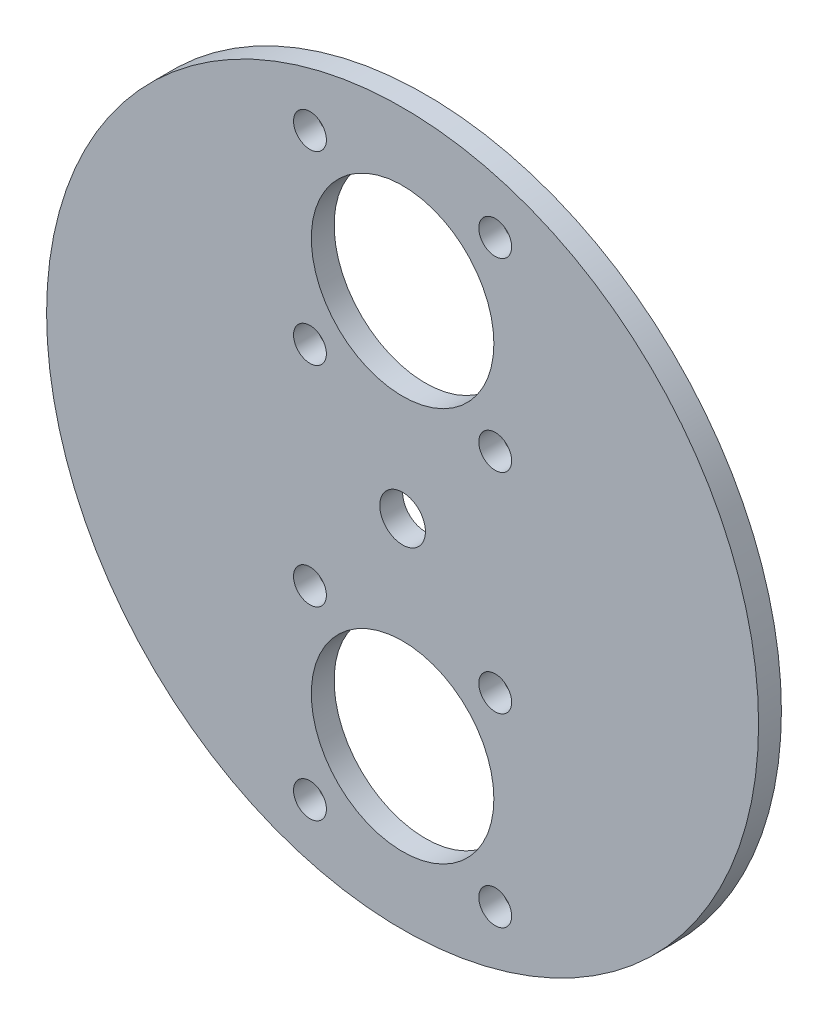
ISO-10303-21;
HEADER;
FILE_DESCRIPTION(('STEP AP214'),'2;1');
FILE_NAME('part.step','',(''),(''),'','','');
FILE_SCHEMA(('AUTOMOTIVE_DESIGN { 1 0 10303 214 1 1 1 1 }'));
ENDSEC;
DATA;
#1=APPLICATION_CONTEXT('core data for automotive mechanical design processes');
#2=APPLICATION_PROTOCOL_DEFINITION('international standard','automotive_design',2000,#1);
#3=PRODUCT_CONTEXT('',#1,'mechanical');
#4=PRODUCT('Part','Part','',(#3));
#5=PRODUCT_RELATED_PRODUCT_CATEGORY('part','',(#4));
#6=PRODUCT_DEFINITION_FORMATION('','',#4);
#7=PRODUCT_DEFINITION_CONTEXT('part definition',#1,'design');
#8=PRODUCT_DEFINITION('design','',#6,#7);
#9=PRODUCT_DEFINITION_SHAPE('','',#8);
#10=(LENGTH_UNIT() NAMED_UNIT(*) SI_UNIT(.MILLI.,.METRE.));
#11=(NAMED_UNIT(*) PLANE_ANGLE_UNIT() SI_UNIT($,.RADIAN.));
#12=(NAMED_UNIT(*) SI_UNIT($,.STERADIAN.) SOLID_ANGLE_UNIT());
#13=UNCERTAINTY_MEASURE_WITH_UNIT(LENGTH_MEASURE(1.E-05),#10,'distance_accuracy_value','');
#14=(GEOMETRIC_REPRESENTATION_CONTEXT(3) GLOBAL_UNCERTAINTY_ASSIGNED_CONTEXT((#13)) GLOBAL_UNIT_ASSIGNED_CONTEXT((#10,
#11,#12)) REPRESENTATION_CONTEXT('',''));
#15=CARTESIAN_POINT('',(0.,0.,0.));
#16=DIRECTION('',(0.,0.,1.));
#17=DIRECTION('',(1.,0.,0.));
#18=AXIS2_PLACEMENT_3D('',#15,#16,#17);
#19=CARTESIAN_POINT('',(0.,0.,3.175));
#20=DIRECTION('',(0.,0.,-1.));
#21=DIRECTION('',(-1.,0.,0.));
#22=AXIS2_PLACEMENT_3D('',#19,#20,#21);
#23=CYLINDRICAL_SURFACE('',#22,49.53);
#24=CARTESIAN_POINT('',(0.,0.,3.175));
#25=DIRECTION('',(0.,0.,1.));
#26=DIRECTION('',(1.,0.,0.));
#27=AXIS2_PLACEMENT_3D('',#24,#25,#26);
#28=CIRCLE('',#27,49.53);
#29=CARTESIAN_POINT('',(49.53,0.,3.175));
#30=VERTEX_POINT('',#29);
#31=EDGE_CURVE('E10',#30,#30,#28,.T.);
#32=ORIENTED_EDGE('',*,*,#31,.F.);
#33=EDGE_LOOP('',(#32));
#34=FACE_BOUND('',#33,.T.);
#35=CARTESIAN_POINT('',(0.,0.,0.));
#36=DIRECTION('',(0.,0.,1.));
#37=DIRECTION('',(1.,0.,0.));
#38=AXIS2_PLACEMENT_3D('',#35,#36,#37);
#39=CIRCLE('',#38,49.53);
#40=CARTESIAN_POINT('',(49.53,0.,0.));
#41=VERTEX_POINT('',#40);
#42=EDGE_CURVE('E46',#41,#41,#39,.T.);
#43=ORIENTED_EDGE('',*,*,#42,.T.);
#44=EDGE_LOOP('',(#43));
#45=FACE_BOUND('',#44,.T.);
#46=ADVANCED_FACE('F43',(#34,#45),#23,.T.);
#47=CARTESIAN_POINT('',(0.,0.,3.175));
#48=DIRECTION('',(0.,0.,1.));
#49=DIRECTION('',(1.,0.,0.));
#50=AXIS2_PLACEMENT_3D('',#47,#48,#49);
#51=PLANE('',#50);
#52=CARTESIAN_POINT('',(-12.8866675337342,40.3186675337343,3.175));
#53=DIRECTION('',(0.,0.,1.));
#54=DIRECTION('',(1.,0.,0.));
#55=AXIS2_PLACEMENT_3D('',#52,#53,#54);
#56=CIRCLE('',#55,2.286);
#57=CARTESIAN_POINT('',(-10.6006675337342,40.3186675337343,3.175));
#58=VERTEX_POINT('',#57);
#59=EDGE_CURVE('E120',#58,#58,#56,.F.);
#60=ORIENTED_EDGE('',*,*,#59,.T.);
#61=EDGE_LOOP('',(#60));
#62=FACE_BOUND('',#61,.T.);
#63=CARTESIAN_POINT('',(12.8866675337343,40.3186675337342,3.175));
#64=DIRECTION('',(0.,0.,1.));
#65=DIRECTION('',(1.,0.,0.));
#66=AXIS2_PLACEMENT_3D('',#63,#64,#65);
#67=CIRCLE('',#66,2.286);
#68=CARTESIAN_POINT('',(15.1726675337343,40.3186675337342,3.175));
#69=VERTEX_POINT('',#68);
#70=EDGE_CURVE('E130',#69,#69,#67,.F.);
#71=ORIENTED_EDGE('',*,*,#70,.T.);
#72=EDGE_LOOP('',(#71));
#73=FACE_BOUND('',#72,.T.);
#74=CARTESIAN_POINT('',(12.8866675337341,14.5453324662656,3.175));
#75=DIRECTION('',(0.,0.,1.));
#76=DIRECTION('',(1.,0.,0.));
#77=AXIS2_PLACEMENT_3D('',#74,#75,#76);
#78=CIRCLE('',#77,2.286);
#79=CARTESIAN_POINT('',(15.1726675337341,14.5453324662656,3.175));
#80=VERTEX_POINT('',#79);
#81=EDGE_CURVE('E121',#80,#80,#78,.F.);
#82=ORIENTED_EDGE('',*,*,#81,.T.);
#83=EDGE_LOOP('',(#82));
#84=FACE_BOUND('',#83,.T.);
#85=CARTESIAN_POINT('',(-12.8866675337343,14.5453324662658,3.175));
#86=DIRECTION('',(0.,0.,1.));
#87=DIRECTION('',(1.,0.,0.));
#88=AXIS2_PLACEMENT_3D('',#85,#86,#87);
#89=CIRCLE('',#88,2.286);
#90=CARTESIAN_POINT('',(-10.6006675337343,14.5453324662658,3.175));
#91=VERTEX_POINT('',#90);
#92=EDGE_CURVE('E98',#91,#91,#89,.F.);
#93=ORIENTED_EDGE('',*,*,#92,.T.);
#94=EDGE_LOOP('',(#93));
#95=FACE_BOUND('',#94,.T.);
#96=CARTESIAN_POINT('',(12.8866675337342,-40.3186675337343,3.175));
#97=DIRECTION('',(0.,0.,1.));
#98=DIRECTION('',(1.,0.,0.));
#99=AXIS2_PLACEMENT_3D('',#96,#97,#98);
#100=CIRCLE('',#99,2.286);
#101=CARTESIAN_POINT('',(15.1726675337342,-40.3186675337343,3.175));
#102=VERTEX_POINT('',#101);
#103=EDGE_CURVE('E88',#102,#102,#100,.F.);
#104=ORIENTED_EDGE('',*,*,#103,.T.);
#105=EDGE_LOOP('',(#104));
#106=FACE_BOUND('',#105,.T.);
#107=CARTESIAN_POINT('',(-12.8866675337342,-40.3186675337342,3.175));
#108=DIRECTION('',(0.,0.,1.));
#109=DIRECTION('',(1.,0.,0.));
#110=AXIS2_PLACEMENT_3D('',#107,#108,#109);
#111=CIRCLE('',#110,2.286);
#112=CARTESIAN_POINT('',(-10.6006675337342,-40.3186675337342,3.175));
#113=VERTEX_POINT('',#112);
#114=EDGE_CURVE('E99',#113,#113,#111,.F.);
#115=ORIENTED_EDGE('',*,*,#114,.T.);
#116=EDGE_LOOP('',(#115));
#117=FACE_BOUND('',#116,.T.);
#118=CARTESIAN_POINT('',(-12.8866675337341,-14.5453324662656,3.175));
#119=DIRECTION('',(0.,0.,1.));
#120=DIRECTION('',(1.,0.,0.));
#121=AXIS2_PLACEMENT_3D('',#118,#119,#120);
#122=CIRCLE('',#121,2.286);
#123=CARTESIAN_POINT('',(-10.6006675337341,-14.5453324662656,3.175));
#124=VERTEX_POINT('',#123);
#125=EDGE_CURVE('E89',#124,#124,#122,.F.);
#126=ORIENTED_EDGE('',*,*,#125,.T.);
#127=EDGE_LOOP('',(#126));
#128=FACE_BOUND('',#127,.T.);
#129=CARTESIAN_POINT('',(12.8866675337343,-14.5453324662658,3.175));
#130=DIRECTION('',(0.,0.,1.));
#131=DIRECTION('',(1.,0.,0.));
#132=AXIS2_PLACEMENT_3D('',#129,#130,#131);
#133=CIRCLE('',#132,2.286);
#134=CARTESIAN_POINT('',(15.1726675337343,-14.5453324662658,3.175));
#135=VERTEX_POINT('',#134);
#136=EDGE_CURVE('E80',#135,#135,#133,.F.);
#137=ORIENTED_EDGE('',*,*,#136,.T.);
#138=EDGE_LOOP('',(#137));
#139=FACE_BOUND('',#138,.T.);
#140=CARTESIAN_POINT('',(0.,0.,3.175));
#141=DIRECTION('',(0.,0.,1.));
#142=DIRECTION('',(1.,0.,0.));
#143=AXIS2_PLACEMENT_3D('',#140,#141,#142);
#144=CIRCLE('',#143,3.175);
#145=CARTESIAN_POINT('',(3.175,0.,3.175));
#146=VERTEX_POINT('',#145);
#147=EDGE_CURVE('E76',#146,#146,#144,.T.);
#148=ORIENTED_EDGE('',*,*,#147,.F.);
#149=EDGE_LOOP('',(#148));
#150=FACE_BOUND('',#149,.T.);
#151=CARTESIAN_POINT('',(0.,27.432,3.175));
#152=DIRECTION('',(0.,0.,1.));
#153=DIRECTION('',(1.,0.,0.));
#154=AXIS2_PLACEMENT_3D('',#151,#152,#153);
#155=CIRCLE('',#154,12.7);
#156=CARTESIAN_POINT('',(12.7,27.432,3.175));
#157=VERTEX_POINT('',#156);
#158=EDGE_CURVE('E61',#157,#157,#155,.T.);
#159=ORIENTED_EDGE('',*,*,#158,.F.);
#160=EDGE_LOOP('',(#159));
#161=FACE_BOUND('',#160,.T.);
#162=CARTESIAN_POINT('',(0.,-27.432,3.175));
#163=DIRECTION('',(0.,0.,1.));
#164=DIRECTION('',(1.,0.,0.));
#165=AXIS2_PLACEMENT_3D('',#162,#163,#164);
#166=CIRCLE('',#165,12.7);
#167=CARTESIAN_POINT('',(12.7,-27.432,3.175));
#168=VERTEX_POINT('',#167);
#169=EDGE_CURVE('E57',#168,#168,#166,.T.);
#170=ORIENTED_EDGE('',*,*,#169,.F.);
#171=EDGE_LOOP('',(#170));
#172=FACE_BOUND('',#171,.T.);
#173=ORIENTED_EDGE('',*,*,#31,.T.);
#174=EDGE_LOOP('',(#173));
#175=FACE_BOUND('',#174,.T.);
#176=ADVANCED_FACE('F152',(#62,#73,#84,#95,#106,#117,#128,#139,#150,#161,#172,#175),#51,.T.);
#177=CARTESIAN_POINT('',(0.,0.,0.));
#178=DIRECTION('',(0.,0.,1.));
#179=DIRECTION('',(1.,0.,0.));
#180=AXIS2_PLACEMENT_3D('',#177,#178,#179);
#181=PLANE('',#180);
#182=CARTESIAN_POINT('',(-12.8866675337342,40.3186675337343,0.));
#183=DIRECTION('',(0.,0.,-1.));
#184=DIRECTION('',(0.,1.,0.));
#185=AXIS2_PLACEMENT_3D('',#182,#183,#184);
#186=CIRCLE('',#185,2.286);
#187=CARTESIAN_POINT('',(-12.8866675337342,42.6046675337343,0.));
#188=VERTEX_POINT('',#187);
#189=EDGE_CURVE('E134',#188,#188,#186,.T.);
#190=ORIENTED_EDGE('',*,*,#189,.F.);
#191=EDGE_LOOP('',(#190));
#192=FACE_BOUND('',#191,.T.);
#193=CARTESIAN_POINT('',(12.8866675337343,40.3186675337342,0.));
#194=DIRECTION('',(0.,0.,-1.));
#195=DIRECTION('',(1.,0.,0.));
#196=AXIS2_PLACEMENT_3D('',#193,#194,#195);
#197=CIRCLE('',#196,2.286);
#198=CARTESIAN_POINT('',(15.1726675337343,40.3186675337342,0.));
#199=VERTEX_POINT('',#198);
#200=EDGE_CURVE('E125',#199,#199,#197,.T.);
#201=ORIENTED_EDGE('',*,*,#200,.F.);
#202=EDGE_LOOP('',(#201));
#203=FACE_BOUND('',#202,.T.);
#204=CARTESIAN_POINT('',(12.8866675337341,14.5453324662656,0.));
#205=DIRECTION('',(0.,0.,-1.));
#206=DIRECTION('',(0.,-1.,0.));
#207=AXIS2_PLACEMENT_3D('',#204,#205,#206);
#208=CIRCLE('',#207,2.286);
#209=CARTESIAN_POINT('',(12.8866675337341,12.2593324662656,0.));
#210=VERTEX_POINT('',#209);
#211=EDGE_CURVE('E126',#210,#210,#208,.T.);
#212=ORIENTED_EDGE('',*,*,#211,.F.);
#213=EDGE_LOOP('',(#212));
#214=FACE_BOUND('',#213,.T.);
#215=CARTESIAN_POINT('',(-12.8866675337343,14.5453324662658,0.));
#216=DIRECTION('',(0.,0.,-1.));
#217=DIRECTION('',(-1.,0.,0.));
#218=AXIS2_PLACEMENT_3D('',#215,#216,#217);
#219=CIRCLE('',#218,2.286);
#220=CARTESIAN_POINT('',(-15.1726675337343,14.5453324662658,0.));
#221=VERTEX_POINT('',#220);
#222=EDGE_CURVE('E116',#221,#221,#219,.T.);
#223=ORIENTED_EDGE('',*,*,#222,.F.);
#224=EDGE_LOOP('',(#223));
#225=FACE_BOUND('',#224,.T.);
#226=CARTESIAN_POINT('',(12.8866675337342,-40.3186675337343,0.));
#227=DIRECTION('',(0.,0.,-1.));
#228=DIRECTION('',(0.,1.,0.));
#229=AXIS2_PLACEMENT_3D('',#226,#227,#228);
#230=CIRCLE('',#229,2.286);
#231=CARTESIAN_POINT('',(12.8866675337342,-38.0326675337343,0.));
#232=VERTEX_POINT('',#231);
#233=EDGE_CURVE('E103',#232,#232,#230,.T.);
#234=ORIENTED_EDGE('',*,*,#233,.F.);
#235=EDGE_LOOP('',(#234));
#236=FACE_BOUND('',#235,.T.);
#237=CARTESIAN_POINT('',(-12.8866675337342,-40.3186675337342,0.));
#238=DIRECTION('',(0.,0.,-1.));
#239=DIRECTION('',(1.,0.,0.));
#240=AXIS2_PLACEMENT_3D('',#237,#238,#239);
#241=CIRCLE('',#240,2.286);
#242=CARTESIAN_POINT('',(-10.6006675337342,-40.3186675337342,0.));
#243=VERTEX_POINT('',#242);
#244=EDGE_CURVE('E93',#243,#243,#241,.T.);
#245=ORIENTED_EDGE('',*,*,#244,.F.);
#246=EDGE_LOOP('',(#245));
#247=FACE_BOUND('',#246,.T.);
#248=CARTESIAN_POINT('',(-12.8866675337341,-14.5453324662656,0.));
#249=DIRECTION('',(0.,0.,-1.));
#250=DIRECTION('',(0.,-1.,0.));
#251=AXIS2_PLACEMENT_3D('',#248,#249,#250);
#252=CIRCLE('',#251,2.286);
#253=CARTESIAN_POINT('',(-12.8866675337341,-16.8313324662656,0.));
#254=VERTEX_POINT('',#253);
#255=EDGE_CURVE('E94',#254,#254,#252,.T.);
#256=ORIENTED_EDGE('',*,*,#255,.F.);
#257=EDGE_LOOP('',(#256));
#258=FACE_BOUND('',#257,.T.);
#259=CARTESIAN_POINT('',(12.8866675337343,-14.5453324662658,0.));
#260=DIRECTION('',(0.,0.,-1.));
#261=DIRECTION('',(-1.,0.,0.));
#262=AXIS2_PLACEMENT_3D('',#259,#260,#261);
#263=CIRCLE('',#262,2.286);
#264=CARTESIAN_POINT('',(10.6006675337343,-14.5453324662658,0.));
#265=VERTEX_POINT('',#264);
#266=EDGE_CURVE('E84',#265,#265,#263,.T.);
#267=ORIENTED_EDGE('',*,*,#266,.F.);
#268=EDGE_LOOP('',(#267));
#269=FACE_BOUND('',#268,.T.);
#270=CARTESIAN_POINT('',(0.,0.,0.));
#271=DIRECTION('',(0.,0.,1.));
#272=DIRECTION('',(1.,0.,0.));
#273=AXIS2_PLACEMENT_3D('',#270,#271,#272);
#274=CIRCLE('',#273,3.175);
#275=CARTESIAN_POINT('',(3.175,0.,0.));
#276=VERTEX_POINT('',#275);
#277=EDGE_CURVE('E66',#276,#276,#274,.F.);
#278=ORIENTED_EDGE('',*,*,#277,.F.);
#279=EDGE_LOOP('',(#278));
#280=FACE_BOUND('',#279,.T.);
#281=CARTESIAN_POINT('',(0.,27.432,0.));
#282=DIRECTION('',(0.,0.,1.));
#283=DIRECTION('',(1.,0.,0.));
#284=AXIS2_PLACEMENT_3D('',#281,#282,#283);
#285=CIRCLE('',#284,12.7);
#286=CARTESIAN_POINT('',(12.7,27.432,0.));
#287=VERTEX_POINT('',#286);
#288=EDGE_CURVE('E55',#287,#287,#285,.F.);
#289=ORIENTED_EDGE('',*,*,#288,.F.);
#290=EDGE_LOOP('',(#289));
#291=FACE_BOUND('',#290,.T.);
#292=CARTESIAN_POINT('',(0.,-27.432,0.));
#293=DIRECTION('',(0.,0.,1.));
#294=DIRECTION('',(1.,0.,0.));
#295=AXIS2_PLACEMENT_3D('',#292,#293,#294);
#296=CIRCLE('',#295,12.7);
#297=CARTESIAN_POINT('',(12.7,-27.432,0.));
#298=VERTEX_POINT('',#297);
#299=EDGE_CURVE('E62',#298,#298,#296,.F.);
#300=ORIENTED_EDGE('',*,*,#299,.F.);
#301=EDGE_LOOP('',(#300));
#302=FACE_BOUND('',#301,.T.);
#303=ORIENTED_EDGE('',*,*,#42,.F.);
#304=EDGE_LOOP('',(#303));
#305=FACE_BOUND('',#304,.T.);
#306=ADVANCED_FACE('F148',(#192,#203,#214,#225,#236,#247,#258,#269,#280,#291,#302,#305),#181,.F.);
#307=CARTESIAN_POINT('',(0.,-27.432,-35.9210244842766));
#308=DIRECTION('',(0.,0.,1.));
#309=DIRECTION('',(1.,0.,0.));
#310=AXIS2_PLACEMENT_3D('',#307,#308,#309);
#311=CYLINDRICAL_SURFACE('',#310,12.7);
#312=ORIENTED_EDGE('',*,*,#299,.T.);
#313=EDGE_LOOP('',(#312));
#314=FACE_BOUND('',#313,.T.);
#315=ORIENTED_EDGE('',*,*,#169,.T.);
#316=EDGE_LOOP('',(#315));
#317=FACE_BOUND('',#316,.T.);
#318=ADVANCED_FACE('F151',(#314,#317),#311,.F.);
#319=CARTESIAN_POINT('',(0.,27.432,-35.9210244842766));
#320=DIRECTION('',(0.,0.,1.));
#321=DIRECTION('',(1.,0.,0.));
#322=AXIS2_PLACEMENT_3D('',#319,#320,#321);
#323=CYLINDRICAL_SURFACE('',#322,12.7);
#324=ORIENTED_EDGE('',*,*,#288,.T.);
#325=EDGE_LOOP('',(#324));
#326=FACE_BOUND('',#325,.T.);
#327=ORIENTED_EDGE('',*,*,#158,.T.);
#328=EDGE_LOOP('',(#327));
#329=FACE_BOUND('',#328,.T.);
#330=ADVANCED_FACE('F189',(#326,#329),#323,.F.);
#331=CARTESIAN_POINT('',(0.,0.,-8.98025612106915));
#332=DIRECTION('',(0.,0.,1.));
#333=DIRECTION('',(1.,0.,0.));
#334=AXIS2_PLACEMENT_3D('',#331,#332,#333);
#335=CYLINDRICAL_SURFACE('',#334,3.175);
#336=ORIENTED_EDGE('',*,*,#277,.T.);
#337=EDGE_LOOP('',(#336));
#338=FACE_BOUND('',#337,.T.);
#339=ORIENTED_EDGE('',*,*,#147,.T.);
#340=EDGE_LOOP('',(#339));
#341=FACE_BOUND('',#340,.T.);
#342=ADVANCED_FACE('F193',(#338,#341),#335,.F.);
#343=CARTESIAN_POINT('',(12.8866675337343,-14.5453324662658,9.64078440716979));
#344=DIRECTION('',(0.,0.,-1.));
#345=DIRECTION('',(-1.,0.,0.));
#346=AXIS2_PLACEMENT_3D('',#343,#344,#345);
#347=CYLINDRICAL_SURFACE('',#346,2.286);
#348=ORIENTED_EDGE('',*,*,#266,.T.);
#349=EDGE_LOOP('',(#348));
#350=FACE_BOUND('',#349,.T.);
#351=ORIENTED_EDGE('',*,*,#136,.F.);
#352=EDGE_LOOP('',(#351));
#353=FACE_BOUND('',#352,.T.);
#354=ADVANCED_FACE('F197',(#350,#353),#347,.F.);
#355=CARTESIAN_POINT('',(-12.8866675337341,-14.5453324662656,9.64078440716979));
#356=DIRECTION('',(0.,0.,-1.));
#357=DIRECTION('',(-1.,0.,0.));
#358=AXIS2_PLACEMENT_3D('',#355,#356,#357);
#359=CYLINDRICAL_SURFACE('',#358,2.286);
#360=ORIENTED_EDGE('',*,*,#255,.T.);
#361=EDGE_LOOP('',(#360));
#362=FACE_BOUND('',#361,.T.);
#363=ORIENTED_EDGE('',*,*,#125,.F.);
#364=EDGE_LOOP('',(#363));
#365=FACE_BOUND('',#364,.T.);
#366=ADVANCED_FACE('F201',(#362,#365),#359,.F.);
#367=CARTESIAN_POINT('',(-12.8866675337342,-40.3186675337342,9.64078440716979));
#368=DIRECTION('',(0.,0.,-1.));
#369=DIRECTION('',(-1.,0.,0.));
#370=AXIS2_PLACEMENT_3D('',#367,#368,#369);
#371=CYLINDRICAL_SURFACE('',#370,2.286);
#372=ORIENTED_EDGE('',*,*,#244,.T.);
#373=EDGE_LOOP('',(#372));
#374=FACE_BOUND('',#373,.T.);
#375=ORIENTED_EDGE('',*,*,#114,.F.);
#376=EDGE_LOOP('',(#375));
#377=FACE_BOUND('',#376,.T.);
#378=ADVANCED_FACE('F205',(#374,#377),#371,.F.);
#379=CARTESIAN_POINT('',(12.8866675337342,-40.3186675337343,9.64078440716979));
#380=DIRECTION('',(0.,0.,-1.));
#381=DIRECTION('',(-1.,0.,0.));
#382=AXIS2_PLACEMENT_3D('',#379,#380,#381);
#383=CYLINDRICAL_SURFACE('',#382,2.286);
#384=ORIENTED_EDGE('',*,*,#233,.T.);
#385=EDGE_LOOP('',(#384));
#386=FACE_BOUND('',#385,.T.);
#387=ORIENTED_EDGE('',*,*,#103,.F.);
#388=EDGE_LOOP('',(#387));
#389=FACE_BOUND('',#388,.T.);
#390=ADVANCED_FACE('F209',(#386,#389),#383,.F.);
#391=CARTESIAN_POINT('',(-12.8866675337343,14.5453324662658,9.64078440716979));
#392=DIRECTION('',(0.,0.,-1.));
#393=DIRECTION('',(-1.,0.,0.));
#394=AXIS2_PLACEMENT_3D('',#391,#392,#393);
#395=CYLINDRICAL_SURFACE('',#394,2.286);
#396=ORIENTED_EDGE('',*,*,#222,.T.);
#397=EDGE_LOOP('',(#396));
#398=FACE_BOUND('',#397,.T.);
#399=ORIENTED_EDGE('',*,*,#92,.F.);
#400=EDGE_LOOP('',(#399));
#401=FACE_BOUND('',#400,.T.);
#402=ADVANCED_FACE('F213',(#398,#401),#395,.F.);
#403=CARTESIAN_POINT('',(12.8866675337341,14.5453324662656,9.64078440716979));
#404=DIRECTION('',(0.,0.,-1.));
#405=DIRECTION('',(-1.,0.,0.));
#406=AXIS2_PLACEMENT_3D('',#403,#404,#405);
#407=CYLINDRICAL_SURFACE('',#406,2.286);
#408=ORIENTED_EDGE('',*,*,#211,.T.);
#409=EDGE_LOOP('',(#408));
#410=FACE_BOUND('',#409,.T.);
#411=ORIENTED_EDGE('',*,*,#81,.F.);
#412=EDGE_LOOP('',(#411));
#413=FACE_BOUND('',#412,.T.);
#414=ADVANCED_FACE('F216',(#410,#413),#407,.F.);
#415=CARTESIAN_POINT('',(12.8866675337343,40.3186675337342,9.64078440716979));
#416=DIRECTION('',(0.,0.,-1.));
#417=DIRECTION('',(-1.,0.,0.));
#418=AXIS2_PLACEMENT_3D('',#415,#416,#417);
#419=CYLINDRICAL_SURFACE('',#418,2.286);
#420=ORIENTED_EDGE('',*,*,#200,.T.);
#421=EDGE_LOOP('',(#420));
#422=FACE_BOUND('',#421,.T.);
#423=ORIENTED_EDGE('',*,*,#70,.F.);
#424=EDGE_LOOP('',(#423));
#425=FACE_BOUND('',#424,.T.);
#426=ADVANCED_FACE('F220',(#422,#425),#419,.F.);
#427=CARTESIAN_POINT('',(-12.8866675337342,40.3186675337343,9.64078440716979));
#428=DIRECTION('',(0.,0.,-1.));
#429=DIRECTION('',(-1.,0.,0.));
#430=AXIS2_PLACEMENT_3D('',#427,#428,#429);
#431=CYLINDRICAL_SURFACE('',#430,2.286);
#432=ORIENTED_EDGE('',*,*,#189,.T.);
#433=EDGE_LOOP('',(#432));
#434=FACE_BOUND('',#433,.T.);
#435=ORIENTED_EDGE('',*,*,#59,.F.);
#436=EDGE_LOOP('',(#435));
#437=FACE_BOUND('',#436,.T.);
#438=ADVANCED_FACE('F145',(#434,#437),#431,.F.);
#439=CLOSED_SHELL('',(#46,#176,#306,#318,#330,#342,#354,#366,#378,#390,#402,#414,#426,#438));
#440=MANIFOLD_SOLID_BREP('B2',#439);
#441=ADVANCED_BREP_SHAPE_REPRESENTATION('',(#18,#440),#14);
#442=SHAPE_DEFINITION_REPRESENTATION(#9,#441);
ENDSEC;
END-ISO-10303-21;
